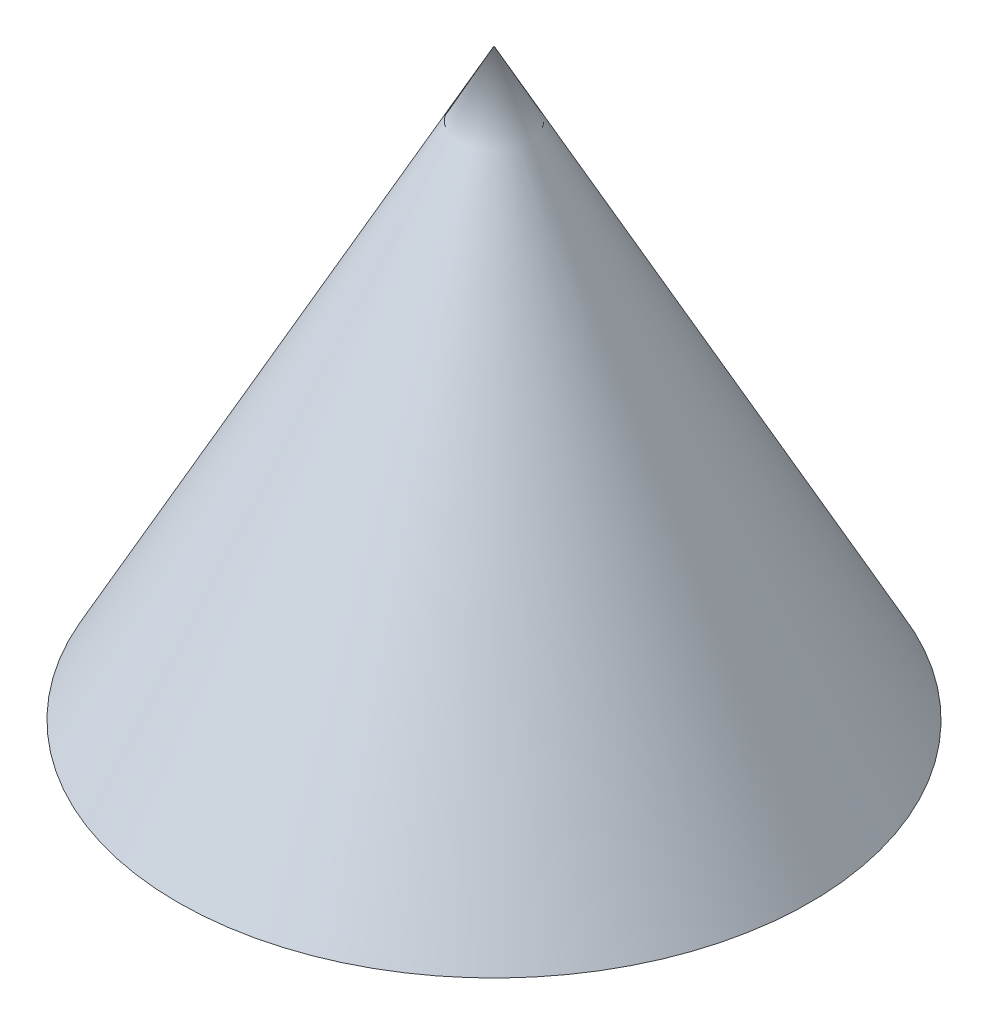
ISO-10303-21;
HEADER;
FILE_DESCRIPTION(('STEP AP214'),'2;1');
FILE_NAME('part.step','',(''),(''),'','','');
FILE_SCHEMA(('AUTOMOTIVE_DESIGN { 1 0 10303 214 1 1 1 1 }'));
ENDSEC;
DATA;
#1=APPLICATION_CONTEXT('core data for automotive mechanical design processes');
#2=APPLICATION_PROTOCOL_DEFINITION('international standard','automotive_design',2000,#1);
#3=PRODUCT_CONTEXT('',#1,'mechanical');
#4=PRODUCT('Part','Part','',(#3));
#5=PRODUCT_RELATED_PRODUCT_CATEGORY('part','',(#4));
#6=PRODUCT_DEFINITION_FORMATION('','',#4);
#7=PRODUCT_DEFINITION_CONTEXT('part definition',#1,'design');
#8=PRODUCT_DEFINITION('design','',#6,#7);
#9=PRODUCT_DEFINITION_SHAPE('','',#8);
#10=(LENGTH_UNIT() NAMED_UNIT(*) SI_UNIT(.MILLI.,.METRE.));
#11=(NAMED_UNIT(*) PLANE_ANGLE_UNIT() SI_UNIT($,.RADIAN.));
#12=(NAMED_UNIT(*) SI_UNIT($,.STERADIAN.) SOLID_ANGLE_UNIT());
#13=UNCERTAINTY_MEASURE_WITH_UNIT(LENGTH_MEASURE(1.E-05),#10,'distance_accuracy_value','');
#14=(GEOMETRIC_REPRESENTATION_CONTEXT(3) GLOBAL_UNCERTAINTY_ASSIGNED_CONTEXT((#13)) GLOBAL_UNIT_ASSIGNED_CONTEXT((#10,
#11,#12)) REPRESENTATION_CONTEXT('',''));
#15=CARTESIAN_POINT('',(0.,0.,0.));
#16=DIRECTION('',(0.,0.,1.));
#17=DIRECTION('',(1.,0.,0.));
#18=AXIS2_PLACEMENT_3D('',#15,#16,#17);
#19=CARTESIAN_POINT('',(-3.25,0.,0.));
#20=DIRECTION('',(0.,1.,0.));
#21=DIRECTION('',(0.,0.,1.));
#22=AXIS2_PLACEMENT_3D('',#19,#20,#21);
#23=PLANE('',#22);
#24=CARTESIAN_POINT('',(0.,0.,0.));
#25=DIRECTION('',(0.,-1.,0.));
#26=DIRECTION('',(0.,0.,-1.));
#27=AXIS2_PLACEMENT_3D('',#24,#25,#26);
#28=CIRCLE('',#27,0.9);
#29=CARTESIAN_POINT('',(0.,0.,-0.9));
#30=VERTEX_POINT('',#29);
#31=EDGE_CURVE('E63',#30,#30,#28,.T.);
#32=ORIENTED_EDGE('',*,*,#31,.F.);
#33=EDGE_LOOP('',(#32));
#34=FACE_BOUND('',#33,.T.);
#35=CARTESIAN_POINT('',(0.,0.,0.));
#36=DIRECTION('',(0.,-1.,0.));
#37=DIRECTION('',(0.,0.,-1.));
#38=AXIS2_PLACEMENT_3D('',#35,#36,#37);
#39=CIRCLE('',#38,3.25);
#40=CARTESIAN_POINT('',(0.,0.,-3.25));
#41=VERTEX_POINT('',#40);
#42=EDGE_CURVE('E11',#41,#41,#39,.T.);
#43=ORIENTED_EDGE('',*,*,#42,.T.);
#44=EDGE_LOOP('',(#43));
#45=FACE_BOUND('',#44,.T.);
#46=ADVANCED_FACE('F33',(#34,#45),#23,.F.);
#47=CARTESIAN_POINT('',(0.,6.,0.));
#48=DIRECTION('',(0.,-1.,0.));
#49=DIRECTION('',(0.,0.,-1.));
#50=AXIS2_PLACEMENT_3D('',#47,#48,#49);
#51=CONICAL_SURFACE('',#50,0.,0.496422753404882);
#52=ORIENTED_EDGE('',*,*,#42,.F.);
#53=EDGE_LOOP('',(#52));
#54=FACE_BOUND('',#53,.T.);
#55=CARTESIAN_POINT('',(0.,6.,0.));
#56=VERTEX_POINT('',#55);
#57=VERTEX_LOOP('',#56);
#58=FACE_BOUND('',#57,.T.);
#59=ADVANCED_FACE('F42',(#54,#58),#51,.T.);
#60=CARTESIAN_POINT('',(0.,3.,0.));
#61=DIRECTION('',(0.,-1.,0.));
#62=DIRECTION('',(0.,0.,-1.));
#63=AXIS2_PLACEMENT_3D('',#60,#61,#62);
#64=CYLINDRICAL_SURFACE('',#63,0.9);
#65=CARTESIAN_POINT('',(0.,3.,0.));
#66=DIRECTION('',(0.,-1.,0.));
#67=DIRECTION('',(0.,0.,-1.));
#68=AXIS2_PLACEMENT_3D('',#65,#66,#67);
#69=CIRCLE('',#68,0.9);
#70=CARTESIAN_POINT('',(0.,3.,-0.9));
#71=VERTEX_POINT('',#70);
#72=EDGE_CURVE('E39',#71,#71,#69,.T.);
#73=ORIENTED_EDGE('',*,*,#72,.F.);
#74=EDGE_LOOP('',(#73));
#75=FACE_BOUND('',#74,.T.);
#76=ORIENTED_EDGE('',*,*,#31,.T.);
#77=EDGE_LOOP('',(#76));
#78=FACE_BOUND('',#77,.T.);
#79=ADVANCED_FACE('F44',(#75,#78),#64,.F.);
#80=CARTESIAN_POINT('',(0.,3.,0.));
#81=DIRECTION('',(0.,-1.,0.));
#82=DIRECTION('',(0.,0.,-1.));
#83=AXIS2_PLACEMENT_3D('',#80,#81,#82);
#84=PLANE('',#83);
#85=ORIENTED_EDGE('',*,*,#72,.T.);
#86=EDGE_LOOP('',(#85));
#87=FACE_BOUND('',#86,.T.);
#88=ADVANCED_FACE('F50',(#87),#84,.T.);
#89=CLOSED_SHELL('',(#46,#59,#79,#88));
#90=MANIFOLD_SOLID_BREP('B2',#89);
#91=ADVANCED_BREP_SHAPE_REPRESENTATION('',(#18,#90),#14);
#92=SHAPE_DEFINITION_REPRESENTATION(#9,#91);
ENDSEC;
END-ISO-10303-21;
